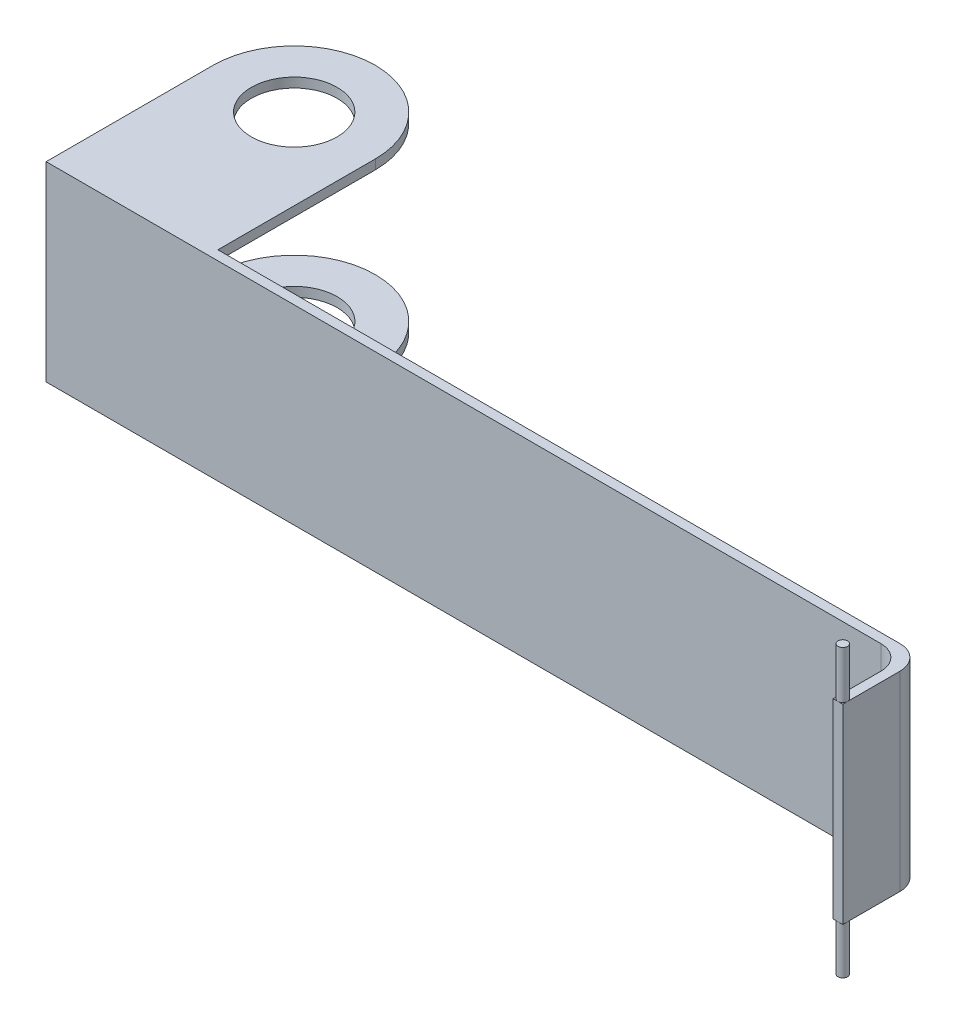
ISO-10303-21;
HEADER;
FILE_DESCRIPTION(('STEP AP214'),'2;1');
FILE_NAME('part.step','',(''),(''),'','','');
FILE_SCHEMA(('AUTOMOTIVE_DESIGN { 1 0 10303 214 1 1 1 1 }'));
ENDSEC;
DATA;
#1=APPLICATION_CONTEXT('core data for automotive mechanical design processes');
#2=APPLICATION_PROTOCOL_DEFINITION('international standard','automotive_design',2000,#1);
#3=PRODUCT_CONTEXT('',#1,'mechanical');
#4=PRODUCT('Part','Part','',(#3));
#5=PRODUCT_RELATED_PRODUCT_CATEGORY('part','',(#4));
#6=PRODUCT_DEFINITION_FORMATION('','',#4);
#7=PRODUCT_DEFINITION_CONTEXT('part definition',#1,'design');
#8=PRODUCT_DEFINITION('design','',#6,#7);
#9=PRODUCT_DEFINITION_SHAPE('','',#8);
#10=(LENGTH_UNIT() NAMED_UNIT(*) SI_UNIT(.MILLI.,.METRE.));
#11=(NAMED_UNIT(*) PLANE_ANGLE_UNIT() SI_UNIT($,.RADIAN.));
#12=(NAMED_UNIT(*) SI_UNIT($,.STERADIAN.) SOLID_ANGLE_UNIT());
#13=UNCERTAINTY_MEASURE_WITH_UNIT(LENGTH_MEASURE(1.E-05),#10,'distance_accuracy_value','');
#14=(GEOMETRIC_REPRESENTATION_CONTEXT(3) GLOBAL_UNCERTAINTY_ASSIGNED_CONTEXT((#13)) GLOBAL_UNIT_ASSIGNED_CONTEXT((#10,
#11,#12)) REPRESENTATION_CONTEXT('',''));
#15=CARTESIAN_POINT('',(0.,0.,0.));
#16=DIRECTION('',(0.,0.,1.));
#17=DIRECTION('',(1.,0.,0.));
#18=AXIS2_PLACEMENT_3D('',#15,#16,#17);
#19=CARTESIAN_POINT('',(0.,0.,0.));
#20=DIRECTION('',(0.,1.,0.));
#21=DIRECTION('',(0.,0.,1.));
#22=AXIS2_PLACEMENT_3D('',#19,#20,#21);
#23=PLANE('',#22);
#24=CARTESIAN_POINT('',(18.1,0.,1.4));
#25=DIRECTION('',(0.,-1.,0.));
#26=DIRECTION('',(0.,0.,-1.));
#27=AXIS2_PLACEMENT_3D('',#24,#25,#26);
#28=CIRCLE('',#27,0.0999999999999978);
#29=CARTESIAN_POINT('',(18.2,0.,1.4));
#30=VERTEX_POINT('',#29);
#31=CARTESIAN_POINT('',(18.1,0.,1.5));
#32=VERTEX_POINT('',#31);
#33=EDGE_CURVE('E66',#30,#32,#28,.T.);
#34=ORIENTED_EDGE('',*,*,#33,.F.);
#35=DIRECTION('',(0.,0.,1.));
#36=VECTOR('',#35,1.);
#37=CARTESIAN_POINT('',(18.2,0.,0.));
#38=LINE('',#37,#36);
#39=CARTESIAN_POINT('',(18.2,0.,1.5));
#40=VERTEX_POINT('',#39);
#41=EDGE_CURVE('E182',#30,#40,#38,.T.);
#42=ORIENTED_EDGE('',*,*,#41,.T.);
#43=DIRECTION('',(-1.,0.,0.));
#44=VECTOR('',#43,1.);
#45=CARTESIAN_POINT('',(0.,0.,1.5));
#46=LINE('',#45,#44);
#47=EDGE_CURVE('E193',#40,#32,#46,.T.);
#48=ORIENTED_EDGE('',*,*,#47,.T.);
#49=EDGE_LOOP('',(#34,#42,#48));
#50=FACE_BOUND('',#49,.T.);
#51=ADVANCED_FACE('F55',(#50),#23,.F.);
#52=CARTESIAN_POINT('',(18.,0.,1.4));
#53=VERTEX_POINT('',#52);
#54=EDGE_CURVE('E12',#32,#53,#28,.T.);
#55=ORIENTED_EDGE('',*,*,#54,.F.);
#56=CARTESIAN_POINT('',(18.,0.,1.5));
#57=VERTEX_POINT('',#56);
#58=EDGE_CURVE('E304',#32,#57,#46,.T.);
#59=ORIENTED_EDGE('',*,*,#58,.T.);
#60=DIRECTION('',(0.,0.,1.));
#61=VECTOR('',#60,1.);
#62=CARTESIAN_POINT('',(18.,0.,0.));
#63=LINE('',#62,#61);
#64=EDGE_CURVE('E300',#53,#57,#63,.T.);
#65=ORIENTED_EDGE('',*,*,#64,.F.);
#66=EDGE_LOOP('',(#55,#59,#65));
#67=FACE_BOUND('',#66,.T.);
#68=ADVANCED_FACE('F377',(#67),#23,.F.);
#69=CARTESIAN_POINT('',(0.,4.,0.));
#70=DIRECTION('',(0.,1.,0.));
#71=DIRECTION('',(0.,0.,1.));
#72=AXIS2_PLACEMENT_3D('',#69,#70,#71);
#73=PLANE('',#72);
#74=CARTESIAN_POINT('',(18.1,4.,1.4));
#75=DIRECTION('',(0.,1.,0.));
#76=DIRECTION('',(0.,0.,1.));
#77=AXIS2_PLACEMENT_3D('',#74,#75,#76);
#78=CIRCLE('',#77,0.0999999999999978);
#79=CARTESIAN_POINT('',(18.1,4.,1.5));
#80=VERTEX_POINT('',#79);
#81=CARTESIAN_POINT('',(18.2,4.,1.4));
#82=VERTEX_POINT('',#81);
#83=EDGE_CURVE('E201',#80,#82,#78,.T.);
#84=ORIENTED_EDGE('',*,*,#83,.F.);
#85=DIRECTION('',(-1.,0.,0.));
#86=VECTOR('',#85,1.);
#87=CARTESIAN_POINT('',(0.,4.,1.5));
#88=LINE('',#87,#86);
#89=CARTESIAN_POINT('',(18.2,4.,1.5));
#90=VERTEX_POINT('',#89);
#91=EDGE_CURVE('E288',#90,#80,#88,.T.);
#92=ORIENTED_EDGE('',*,*,#91,.F.);
#93=DIRECTION('',(0.,0.,1.));
#94=VECTOR('',#93,1.);
#95=CARTESIAN_POINT('',(18.2,4.,0.));
#96=LINE('',#95,#94);
#97=EDGE_CURVE('E271',#82,#90,#96,.T.);
#98=ORIENTED_EDGE('',*,*,#97,.F.);
#99=EDGE_LOOP('',(#84,#92,#98));
#100=FACE_BOUND('',#99,.T.);
#101=ADVANCED_FACE('F382',(#100),#73,.T.);
#102=CARTESIAN_POINT('',(18.,4.,1.4));
#103=VERTEX_POINT('',#102);
#104=EDGE_CURVE('E197',#82,#103,#78,.T.);
#105=ORIENTED_EDGE('',*,*,#104,.F.);
#106=CARTESIAN_POINT('',(18.2,4.,0.300000000000004));
#107=VERTEX_POINT('',#106);
#108=EDGE_CURVE('E267',#107,#82,#96,.T.);
#109=ORIENTED_EDGE('',*,*,#108,.F.);
#110=CARTESIAN_POINT('',(17.7,4.,0.3));
#111=DIRECTION('',(0.,1.,0.));
#112=DIRECTION('',(0.,0.,1.));
#113=AXIS2_PLACEMENT_3D('',#110,#111,#112);
#114=CIRCLE('',#113,0.5);
#115=CARTESIAN_POINT('',(17.7,4.,-0.2));
#116=VERTEX_POINT('',#115);
#117=EDGE_CURVE('E270',#107,#116,#114,.T.);
#118=ORIENTED_EDGE('',*,*,#117,.T.);
#119=DIRECTION('',(1.,0.,0.));
#120=VECTOR('',#119,1.);
#121=CARTESIAN_POINT('',(0.,4.,-0.2));
#122=LINE('',#121,#120);
#123=CARTESIAN_POINT('',(3.4,4.,-0.2));
#124=VERTEX_POINT('',#123);
#125=EDGE_CURVE('E274',#124,#116,#122,.T.);
#126=ORIENTED_EDGE('',*,*,#125,.F.);
#127=DIRECTION('',(0.,0.,-1.));
#128=VECTOR('',#127,1.);
#129=CARTESIAN_POINT('',(3.4,4.,-0.2));
#130=LINE('',#129,#128);
#131=CARTESIAN_POINT('',(3.4,4.,-3.5));
#132=VERTEX_POINT('',#131);
#133=EDGE_CURVE('E242',#124,#132,#130,.T.);
#134=ORIENTED_EDGE('',*,*,#133,.T.);
#135=CARTESIAN_POINT('',(1.7,4.,-3.5));
#136=DIRECTION('',(0.,1.,0.));
#137=DIRECTION('',(0.,0.,1.));
#138=AXIS2_PLACEMENT_3D('',#135,#136,#137);
#139=CIRCLE('',#138,1.7);
#140=CARTESIAN_POINT('',(0.,4.,-3.5));
#141=VERTEX_POINT('',#140);
#142=EDGE_CURVE('E249',#132,#141,#139,.T.);
#143=ORIENTED_EDGE('',*,*,#142,.T.);
#144=DIRECTION('',(0.,0.,-1.));
#145=VECTOR('',#144,1.);
#146=CARTESIAN_POINT('',(0.,4.,0.));
#147=LINE('',#146,#145);
#148=CARTESIAN_POINT('',(0.,4.,0.));
#149=VERTEX_POINT('',#148);
#150=EDGE_CURVE('E276',#149,#141,#147,.T.);
#151=ORIENTED_EDGE('',*,*,#150,.F.);
#152=DIRECTION('',(1.,0.,0.));
#153=VECTOR('',#152,1.);
#154=CARTESIAN_POINT('',(0.,4.,0.));
#155=LINE('',#154,#153);
#156=CARTESIAN_POINT('',(17.5,4.,0.));
#157=VERTEX_POINT('',#156);
#158=EDGE_CURVE('E278',#149,#157,#155,.T.);
#159=ORIENTED_EDGE('',*,*,#158,.T.);
#160=CARTESIAN_POINT('',(17.5,4.,0.5));
#161=DIRECTION('',(0.,1.,0.));
#162=DIRECTION('',(0.,0.,1.));
#163=AXIS2_PLACEMENT_3D('',#160,#161,#162);
#164=CIRCLE('',#163,0.5);
#165=CARTESIAN_POINT('',(18.,4.,0.500000000000004));
#166=VERTEX_POINT('',#165);
#167=EDGE_CURVE('E280',#166,#157,#164,.T.);
#168=ORIENTED_EDGE('',*,*,#167,.F.);
#169=DIRECTION('',(0.,0.,1.));
#170=VECTOR('',#169,1.);
#171=CARTESIAN_POINT('',(18.,4.,0.));
#172=LINE('',#171,#170);
#173=EDGE_CURVE('E284',#166,#103,#172,.T.);
#174=ORIENTED_EDGE('',*,*,#173,.T.);
#175=EDGE_LOOP('',(#105,#109,#118,#126,#134,#143,#151,#159,#168,#174));
#176=FACE_BOUND('',#175,.T.);
#177=CARTESIAN_POINT('',(1.7,4.,-3.5));
#178=DIRECTION('',(0.,1.,0.));
#179=DIRECTION('',(0.,0.,1.));
#180=AXIS2_PLACEMENT_3D('',#177,#178,#179);
#181=CIRCLE('',#180,0.9);
#182=CARTESIAN_POINT('',(1.7,4.,-2.6));
#183=VERTEX_POINT('',#182);
#184=EDGE_CURVE('E238',#183,#183,#181,.T.);
#185=ORIENTED_EDGE('',*,*,#184,.F.);
#186=EDGE_LOOP('',(#185));
#187=FACE_BOUND('',#186,.T.);
#188=ADVANCED_FACE('F341',(#176,#187),#73,.T.);
#189=CARTESIAN_POINT('',(18.2,4.,0.));
#190=DIRECTION('',(1.,0.,0.));
#191=DIRECTION('',(0.,0.,-1.));
#192=AXIS2_PLACEMENT_3D('',#189,#190,#191);
#193=PLANE('',#192);
#194=CARTESIAN_POINT('',(18.2,0.,0.300000000000004));
#195=VERTEX_POINT('',#194);
#196=EDGE_CURVE('E175',#195,#30,#38,.T.);
#197=ORIENTED_EDGE('',*,*,#196,.F.);
#198=DIRECTION('',(0.,-1.,0.));
#199=VECTOR('',#198,1.);
#200=CARTESIAN_POINT('',(18.2,4.,0.300000000000004));
#201=LINE('',#200,#199);
#202=EDGE_CURVE('E59',#107,#195,#201,.T.);
#203=ORIENTED_EDGE('',*,*,#202,.F.);
#204=ORIENTED_EDGE('',*,*,#108,.T.);
#205=ORIENTED_EDGE('',*,*,#97,.T.);
#206=DIRECTION('',(0.,-1.,0.));
#207=VECTOR('',#206,1.);
#208=CARTESIAN_POINT('',(18.2,4.,1.5));
#209=LINE('',#208,#207);
#210=EDGE_CURVE('E187',#90,#40,#209,.T.);
#211=ORIENTED_EDGE('',*,*,#210,.T.);
#212=ORIENTED_EDGE('',*,*,#41,.F.);
#213=EDGE_LOOP('',(#197,#203,#204,#205,#211,#212));
#214=FACE_BOUND('',#213,.T.);
#215=ADVANCED_FACE('F57',(#214),#193,.T.);
#216=CARTESIAN_POINT('',(17.7,4.,0.3));
#217=DIRECTION('',(0.,-1.,0.));
#218=DIRECTION('',(0.,0.,-1.));
#219=AXIS2_PLACEMENT_3D('',#216,#217,#218);
#220=CYLINDRICAL_SURFACE('',#219,0.5);
#221=CARTESIAN_POINT('',(17.7,0.,0.3));
#222=DIRECTION('',(0.,1.,0.));
#223=DIRECTION('',(0.,0.,1.));
#224=AXIS2_PLACEMENT_3D('',#221,#222,#223);
#225=CIRCLE('',#224,0.5);
#226=CARTESIAN_POINT('',(17.7,0.,-0.2));
#227=VERTEX_POINT('',#226);
#228=EDGE_CURVE('E180',#195,#227,#225,.T.);
#229=ORIENTED_EDGE('',*,*,#228,.T.);
#230=DIRECTION('',(0.,-1.,0.));
#231=VECTOR('',#230,1.);
#232=CARTESIAN_POINT('',(17.7,4.,-0.2));
#233=LINE('',#232,#231);
#234=EDGE_CURVE('E319',#116,#227,#233,.T.);
#235=ORIENTED_EDGE('',*,*,#234,.F.);
#236=ORIENTED_EDGE('',*,*,#117,.F.);
#237=ORIENTED_EDGE('',*,*,#202,.T.);
#238=EDGE_LOOP('',(#229,#235,#236,#237));
#239=FACE_BOUND('',#238,.T.);
#240=ADVANCED_FACE('F368',(#239),#220,.T.);
#241=CARTESIAN_POINT('',(0.,4.,-0.2));
#242=DIRECTION('',(0.,0.,-1.));
#243=DIRECTION('',(-1.,0.,0.));
#244=AXIS2_PLACEMENT_3D('',#241,#242,#243);
#245=PLANE('',#244);
#246=DIRECTION('',(0.,-1.,0.));
#247=VECTOR('',#246,1.);
#248=CARTESIAN_POINT('',(3.4,4.,-0.2));
#249=LINE('',#248,#247);
#250=CARTESIAN_POINT('',(3.4,0.2,-0.2));
#251=VERTEX_POINT('',#250);
#252=CARTESIAN_POINT('',(3.4,0.,-0.2));
#253=VERTEX_POINT('',#252);
#254=EDGE_CURVE('E230',#251,#253,#249,.T.);
#255=ORIENTED_EDGE('',*,*,#254,.F.);
#256=DIRECTION('',(-1.,0.,0.));
#257=VECTOR('',#256,1.);
#258=CARTESIAN_POINT('',(0.,0.2,-0.2));
#259=LINE('',#258,#257);
#260=CARTESIAN_POINT('',(0.,0.2,-0.2));
#261=VERTEX_POINT('',#260);
#262=EDGE_CURVE('E235',#251,#261,#259,.T.);
#263=ORIENTED_EDGE('',*,*,#262,.T.);
#264=DIRECTION('',(0.,-1.,0.));
#265=VECTOR('',#264,1.);
#266=CARTESIAN_POINT('',(0.,4.,-0.2));
#267=LINE('',#266,#265);
#268=CARTESIAN_POINT('',(0.,3.8,-0.2));
#269=VERTEX_POINT('',#268);
#270=EDGE_CURVE('E317',#269,#261,#267,.T.);
#271=ORIENTED_EDGE('',*,*,#270,.F.);
#272=DIRECTION('',(1.,0.,0.));
#273=VECTOR('',#272,1.);
#274=CARTESIAN_POINT('',(0.,3.8,-0.2));
#275=LINE('',#274,#273);
#276=CARTESIAN_POINT('',(3.4,3.8,-0.2));
#277=VERTEX_POINT('',#276);
#278=EDGE_CURVE('E254',#269,#277,#275,.T.);
#279=ORIENTED_EDGE('',*,*,#278,.T.);
#280=DIRECTION('',(0.,1.,0.));
#281=VECTOR('',#280,1.);
#282=CARTESIAN_POINT('',(3.4,3.8,-0.2));
#283=LINE('',#282,#281);
#284=EDGE_CURVE('E191',#277,#124,#283,.T.);
#285=ORIENTED_EDGE('',*,*,#284,.T.);
#286=ORIENTED_EDGE('',*,*,#125,.T.);
#287=ORIENTED_EDGE('',*,*,#234,.T.);
#288=DIRECTION('',(1.,0.,0.));
#289=VECTOR('',#288,1.);
#290=CARTESIAN_POINT('',(0.,0.,-0.2));
#291=LINE('',#290,#289);
#292=EDGE_CURVE('E291',#253,#227,#291,.T.);
#293=ORIENTED_EDGE('',*,*,#292,.F.);
#294=EDGE_LOOP('',(#255,#263,#271,#279,#285,#286,#287,#293));
#295=FACE_BOUND('',#294,.T.);
#296=ADVANCED_FACE('F366',(#295),#245,.T.);
#297=CARTESIAN_POINT('',(0.,4.,0.));
#298=DIRECTION('',(-1.,0.,0.));
#299=DIRECTION('',(0.,0.,1.));
#300=AXIS2_PLACEMENT_3D('',#297,#298,#299);
#301=PLANE('',#300);
#302=DIRECTION('',(0.,0.,-1.));
#303=VECTOR('',#302,1.);
#304=CARTESIAN_POINT('',(0.,0.,0.));
#305=LINE('',#304,#303);
#306=CARTESIAN_POINT('',(0.,0.,0.));
#307=VERTEX_POINT('',#306);
#308=CARTESIAN_POINT('',(0.,0.,-3.5));
#309=VERTEX_POINT('',#308);
#310=EDGE_CURVE('E293',#307,#309,#305,.T.);
#311=ORIENTED_EDGE('',*,*,#310,.F.);
#312=DIRECTION('',(0.,-1.,0.));
#313=VECTOR('',#312,1.);
#314=CARTESIAN_POINT('',(0.,4.,0.));
#315=LINE('',#314,#313);
#316=EDGE_CURVE('E315',#149,#307,#315,.T.);
#317=ORIENTED_EDGE('',*,*,#316,.F.);
#318=ORIENTED_EDGE('',*,*,#150,.T.);
#319=DIRECTION('',(0.,1.,0.));
#320=VECTOR('',#319,1.);
#321=CARTESIAN_POINT('',(0.,3.8,-3.5));
#322=LINE('',#321,#320);
#323=CARTESIAN_POINT('',(0.,3.8,-3.5));
#324=VERTEX_POINT('',#323);
#325=EDGE_CURVE('E263',#324,#141,#322,.T.);
#326=ORIENTED_EDGE('',*,*,#325,.F.);
#327=DIRECTION('',(0.,0.,-1.));
#328=VECTOR('',#327,1.);
#329=CARTESIAN_POINT('',(0.,3.8,-0.2));
#330=LINE('',#329,#328);
#331=EDGE_CURVE('E252',#269,#324,#330,.T.);
#332=ORIENTED_EDGE('',*,*,#331,.F.);
#333=ORIENTED_EDGE('',*,*,#270,.T.);
#334=DIRECTION('',(0.,0.,-1.));
#335=VECTOR('',#334,1.);
#336=CARTESIAN_POINT('',(0.,0.2,0.));
#337=LINE('',#336,#335);
#338=CARTESIAN_POINT('',(0.,0.2,-3.5));
#339=VERTEX_POINT('',#338);
#340=EDGE_CURVE('E215',#261,#339,#337,.T.);
#341=ORIENTED_EDGE('',*,*,#340,.T.);
#342=DIRECTION('',(0.,-1.,0.));
#343=VECTOR('',#342,1.);
#344=CARTESIAN_POINT('',(0.,0.2,-3.5));
#345=LINE('',#344,#343);
#346=EDGE_CURVE('E224',#339,#309,#345,.T.);
#347=ORIENTED_EDGE('',*,*,#346,.T.);
#348=EDGE_LOOP('',(#311,#317,#318,#326,#332,#333,#341,#347));
#349=FACE_BOUND('',#348,.T.);
#350=ADVANCED_FACE('F355',(#349),#301,.T.);
#351=CARTESIAN_POINT('',(0.,4.,0.));
#352=DIRECTION('',(0.,0.,-1.));
#353=DIRECTION('',(-1.,0.,0.));
#354=AXIS2_PLACEMENT_3D('',#351,#352,#353);
#355=PLANE('',#354);
#356=DIRECTION('',(1.,0.,0.));
#357=VECTOR('',#356,1.);
#358=CARTESIAN_POINT('',(0.,0.,0.));
#359=LINE('',#358,#357);
#360=CARTESIAN_POINT('',(17.5,0.,0.));
#361=VERTEX_POINT('',#360);
#362=EDGE_CURVE('E295',#307,#361,#359,.T.);
#363=ORIENTED_EDGE('',*,*,#362,.T.);
#364=DIRECTION('',(0.,-1.,0.));
#365=VECTOR('',#364,1.);
#366=CARTESIAN_POINT('',(17.5,4.,0.));
#367=LINE('',#366,#365);
#368=EDGE_CURVE('E312',#157,#361,#367,.T.);
#369=ORIENTED_EDGE('',*,*,#368,.F.);
#370=ORIENTED_EDGE('',*,*,#158,.F.);
#371=ORIENTED_EDGE('',*,*,#316,.T.);
#372=EDGE_LOOP('',(#363,#369,#370,#371));
#373=FACE_BOUND('',#372,.T.);
#374=ADVANCED_FACE('F374',(#373),#355,.F.);
#375=CARTESIAN_POINT('',(17.5,4.,0.5));
#376=DIRECTION('',(0.,-1.,0.));
#377=DIRECTION('',(0.,0.,-1.));
#378=AXIS2_PLACEMENT_3D('',#375,#376,#377);
#379=CYLINDRICAL_SURFACE('',#378,0.5);
#380=CARTESIAN_POINT('',(17.5,0.,0.5));
#381=DIRECTION('',(0.,1.,0.));
#382=DIRECTION('',(0.,0.,1.));
#383=AXIS2_PLACEMENT_3D('',#380,#381,#382);
#384=CIRCLE('',#383,0.5);
#385=CARTESIAN_POINT('',(18.,0.,0.500000000000004));
#386=VERTEX_POINT('',#385);
#387=EDGE_CURVE('E297',#386,#361,#384,.T.);
#388=ORIENTED_EDGE('',*,*,#387,.F.);
#389=DIRECTION('',(0.,-1.,0.));
#390=VECTOR('',#389,1.);
#391=CARTESIAN_POINT('',(18.,4.,0.500000000000004));
#392=LINE('',#391,#390);
#393=EDGE_CURVE('E310',#166,#386,#392,.T.);
#394=ORIENTED_EDGE('',*,*,#393,.F.);
#395=ORIENTED_EDGE('',*,*,#167,.T.);
#396=ORIENTED_EDGE('',*,*,#368,.T.);
#397=EDGE_LOOP('',(#388,#394,#395,#396));
#398=FACE_BOUND('',#397,.T.);
#399=ADVANCED_FACE('F350',(#398),#379,.F.);
#400=CARTESIAN_POINT('',(18.,4.,0.));
#401=DIRECTION('',(1.,0.,0.));
#402=DIRECTION('',(0.,0.,-1.));
#403=AXIS2_PLACEMENT_3D('',#400,#401,#402);
#404=PLANE('',#403);
#405=EDGE_CURVE('E301',#386,#53,#63,.T.);
#406=ORIENTED_EDGE('',*,*,#405,.T.);
#407=ORIENTED_EDGE('',*,*,#64,.T.);
#408=DIRECTION('',(0.,-1.,0.));
#409=VECTOR('',#408,1.);
#410=CARTESIAN_POINT('',(18.,4.,1.5));
#411=LINE('',#410,#409);
#412=CARTESIAN_POINT('',(18.,4.,1.5));
#413=VERTEX_POINT('',#412);
#414=EDGE_CURVE('E307',#413,#57,#411,.T.);
#415=ORIENTED_EDGE('',*,*,#414,.F.);
#416=EDGE_CURVE('E283',#103,#413,#172,.T.);
#417=ORIENTED_EDGE('',*,*,#416,.F.);
#418=ORIENTED_EDGE('',*,*,#173,.F.);
#419=ORIENTED_EDGE('',*,*,#393,.T.);
#420=EDGE_LOOP('',(#406,#407,#415,#417,#418,#419));
#421=FACE_BOUND('',#420,.T.);
#422=ADVANCED_FACE('F338',(#421),#404,.F.);
#423=CARTESIAN_POINT('',(0.,4.,1.5));
#424=DIRECTION('',(0.,0.,1.));
#425=DIRECTION('',(1.,0.,0.));
#426=AXIS2_PLACEMENT_3D('',#423,#424,#425);
#427=PLANE('',#426);
#428=ORIENTED_EDGE('',*,*,#47,.F.);
#429=ORIENTED_EDGE('',*,*,#210,.F.);
#430=ORIENTED_EDGE('',*,*,#91,.T.);
#431=EDGE_CURVE('E287',#80,#413,#88,.T.);
#432=ORIENTED_EDGE('',*,*,#431,.T.);
#433=ORIENTED_EDGE('',*,*,#414,.T.);
#434=ORIENTED_EDGE('',*,*,#58,.F.);
#435=EDGE_LOOP('',(#428,#429,#430,#432,#433,#434));
#436=FACE_BOUND('',#435,.T.);
#437=ADVANCED_FACE('F394',(#436),#427,.T.);
#438=EDGE_CURVE('E199',#103,#80,#78,.T.);
#439=ORIENTED_EDGE('',*,*,#438,.F.);
#440=ORIENTED_EDGE('',*,*,#416,.T.);
#441=ORIENTED_EDGE('',*,*,#431,.F.);
#442=EDGE_LOOP('',(#439,#440,#441));
#443=FACE_BOUND('',#442,.T.);
#444=ADVANCED_FACE('F334',(#443),#73,.T.);
#445=EDGE_CURVE('E64',#53,#30,#28,.T.);
#446=ORIENTED_EDGE('',*,*,#445,.F.);
#447=ORIENTED_EDGE('',*,*,#405,.F.);
#448=ORIENTED_EDGE('',*,*,#387,.T.);
#449=ORIENTED_EDGE('',*,*,#362,.F.);
#450=ORIENTED_EDGE('',*,*,#310,.T.);
#451=CARTESIAN_POINT('',(1.7,0.,-3.5));
#452=DIRECTION('',(0.,-1.,0.));
#453=DIRECTION('',(0.,0.,-1.));
#454=AXIS2_PLACEMENT_3D('',#451,#452,#453);
#455=CIRCLE('',#454,1.7);
#456=CARTESIAN_POINT('',(3.4,0.,-3.5));
#457=VERTEX_POINT('',#456);
#458=EDGE_CURVE('E212',#309,#457,#455,.T.);
#459=ORIENTED_EDGE('',*,*,#458,.T.);
#460=DIRECTION('',(0.,0.,1.));
#461=VECTOR('',#460,1.);
#462=CARTESIAN_POINT('',(3.4,0.,0.));
#463=LINE('',#462,#461);
#464=EDGE_CURVE('E218',#457,#253,#463,.T.);
#465=ORIENTED_EDGE('',*,*,#464,.T.);
#466=ORIENTED_EDGE('',*,*,#292,.T.);
#467=ORIENTED_EDGE('',*,*,#228,.F.);
#468=ORIENTED_EDGE('',*,*,#196,.T.);
#469=EDGE_LOOP('',(#446,#447,#448,#449,#450,#459,#465,#466,#467,#468));
#470=FACE_BOUND('',#469,.T.);
#471=CARTESIAN_POINT('',(1.7,0.,-3.5));
#472=DIRECTION('',(0.,-1.,0.));
#473=DIRECTION('',(0.,0.,-1.));
#474=AXIS2_PLACEMENT_3D('',#471,#472,#473);
#475=CIRCLE('',#474,0.9);
#476=CARTESIAN_POINT('',(1.7,0.,-4.4));
#477=VERTEX_POINT('',#476);
#478=EDGE_CURVE('E206',#477,#477,#475,.T.);
#479=ORIENTED_EDGE('',*,*,#478,.F.);
#480=EDGE_LOOP('',(#479));
#481=FACE_BOUND('',#480,.T.);
#482=ADVANCED_FACE('F177',(#470,#481),#23,.F.);
#483=CARTESIAN_POINT('',(3.4,3.8,-0.2));
#484=DIRECTION('',(1.,0.,0.));
#485=DIRECTION('',(0.,0.,-1.));
#486=AXIS2_PLACEMENT_3D('',#483,#484,#485);
#487=PLANE('',#486);
#488=ORIENTED_EDGE('',*,*,#133,.F.);
#489=ORIENTED_EDGE('',*,*,#284,.F.);
#490=DIRECTION('',(0.,0.,-1.));
#491=VECTOR('',#490,1.);
#492=CARTESIAN_POINT('',(3.4,3.8,-0.2));
#493=LINE('',#492,#491);
#494=CARTESIAN_POINT('',(3.4,3.8,-3.5));
#495=VERTEX_POINT('',#494);
#496=EDGE_CURVE('E245',#277,#495,#493,.T.);
#497=ORIENTED_EDGE('',*,*,#496,.T.);
#498=DIRECTION('',(0.,1.,0.));
#499=VECTOR('',#498,1.);
#500=CARTESIAN_POINT('',(3.4,3.8,-3.5));
#501=LINE('',#500,#499);
#502=EDGE_CURVE('E256',#495,#132,#501,.T.);
#503=ORIENTED_EDGE('',*,*,#502,.T.);
#504=EDGE_LOOP('',(#488,#489,#497,#503));
#505=FACE_BOUND('',#504,.T.);
#506=ADVANCED_FACE('F386',(#505),#487,.T.);
#507=CARTESIAN_POINT('',(1.7,3.8,-3.5));
#508=DIRECTION('',(0.,1.,0.));
#509=DIRECTION('',(0.,0.,1.));
#510=AXIS2_PLACEMENT_3D('',#507,#508,#509);
#511=CYLINDRICAL_SURFACE('',#510,1.7);
#512=ORIENTED_EDGE('',*,*,#142,.F.);
#513=ORIENTED_EDGE('',*,*,#502,.F.);
#514=CARTESIAN_POINT('',(1.7,3.8,-3.5));
#515=DIRECTION('',(0.,1.,0.));
#516=DIRECTION('',(0.,0.,1.));
#517=AXIS2_PLACEMENT_3D('',#514,#515,#516);
#518=CIRCLE('',#517,1.7);
#519=EDGE_CURVE('E248',#495,#324,#518,.T.);
#520=ORIENTED_EDGE('',*,*,#519,.T.);
#521=ORIENTED_EDGE('',*,*,#325,.T.);
#522=EDGE_LOOP('',(#512,#513,#520,#521));
#523=FACE_BOUND('',#522,.T.);
#524=ADVANCED_FACE('F391',(#523),#511,.T.);
#525=CARTESIAN_POINT('',(1.7,3.8,-3.5));
#526=DIRECTION('',(0.,1.,0.));
#527=DIRECTION('',(0.,0.,1.));
#528=AXIS2_PLACEMENT_3D('',#525,#526,#527);
#529=PLANE('',#528);
#530=CARTESIAN_POINT('',(1.7,3.8,-3.5));
#531=DIRECTION('',(0.,1.,0.));
#532=DIRECTION('',(0.,0.,1.));
#533=AXIS2_PLACEMENT_3D('',#530,#531,#532);
#534=CIRCLE('',#533,0.9);
#535=CARTESIAN_POINT('',(1.7,3.8,-2.6));
#536=VERTEX_POINT('',#535);
#537=EDGE_CURVE('E239',#536,#536,#534,.T.);
#538=ORIENTED_EDGE('',*,*,#537,.T.);
#539=EDGE_LOOP('',(#538));
#540=FACE_BOUND('',#539,.T.);
#541=ORIENTED_EDGE('',*,*,#496,.F.);
#542=ORIENTED_EDGE('',*,*,#278,.F.);
#543=ORIENTED_EDGE('',*,*,#331,.T.);
#544=ORIENTED_EDGE('',*,*,#519,.F.);
#545=EDGE_LOOP('',(#541,#542,#543,#544));
#546=FACE_BOUND('',#545,.T.);
#547=ADVANCED_FACE('F442',(#540,#546),#529,.F.);
#548=CARTESIAN_POINT('',(1.7,3.8,-3.5));
#549=DIRECTION('',(0.,1.,0.));
#550=DIRECTION('',(0.,0.,1.));
#551=AXIS2_PLACEMENT_3D('',#548,#549,#550);
#552=CYLINDRICAL_SURFACE('',#551,0.9);
#553=ORIENTED_EDGE('',*,*,#537,.F.);
#554=EDGE_LOOP('',(#553));
#555=FACE_BOUND('',#554,.T.);
#556=ORIENTED_EDGE('',*,*,#184,.T.);
#557=EDGE_LOOP('',(#556));
#558=FACE_BOUND('',#557,.T.);
#559=ADVANCED_FACE('F452',(#555,#558),#552,.F.);
#560=CARTESIAN_POINT('',(3.4,0.2,0.));
#561=DIRECTION('',(1.,0.,0.));
#562=DIRECTION('',(0.,0.,-1.));
#563=AXIS2_PLACEMENT_3D('',#560,#561,#562);
#564=PLANE('',#563);
#565=DIRECTION('',(0.,0.,1.));
#566=VECTOR('',#565,1.);
#567=CARTESIAN_POINT('',(3.4,0.2,0.));
#568=LINE('',#567,#566);
#569=CARTESIAN_POINT('',(3.4,0.2,-3.5));
#570=VERTEX_POINT('',#569);
#571=EDGE_CURVE('E221',#570,#251,#568,.T.);
#572=ORIENTED_EDGE('',*,*,#571,.T.);
#573=ORIENTED_EDGE('',*,*,#254,.T.);
#574=ORIENTED_EDGE('',*,*,#464,.F.);
#575=DIRECTION('',(0.,-1.,0.));
#576=VECTOR('',#575,1.);
#577=CARTESIAN_POINT('',(3.4,0.2,-3.5));
#578=LINE('',#577,#576);
#579=EDGE_CURVE('E228',#570,#457,#578,.T.);
#580=ORIENTED_EDGE('',*,*,#579,.F.);
#581=EDGE_LOOP('',(#572,#573,#574,#580));
#582=FACE_BOUND('',#581,.T.);
#583=ADVANCED_FACE('F364',(#582),#564,.T.);
#584=CARTESIAN_POINT('',(1.7,0.2,-3.5));
#585=DIRECTION('',(0.,-1.,0.));
#586=DIRECTION('',(0.,0.,-1.));
#587=AXIS2_PLACEMENT_3D('',#584,#585,#586);
#588=CYLINDRICAL_SURFACE('',#587,1.7);
#589=ORIENTED_EDGE('',*,*,#458,.F.);
#590=ORIENTED_EDGE('',*,*,#346,.F.);
#591=CARTESIAN_POINT('',(1.7,0.2,-3.5));
#592=DIRECTION('',(0.,-1.,0.));
#593=DIRECTION('',(0.,0.,-1.));
#594=AXIS2_PLACEMENT_3D('',#591,#592,#593);
#595=CIRCLE('',#594,1.7);
#596=EDGE_CURVE('E217',#339,#570,#595,.T.);
#597=ORIENTED_EDGE('',*,*,#596,.T.);
#598=ORIENTED_EDGE('',*,*,#579,.T.);
#599=EDGE_LOOP('',(#589,#590,#597,#598));
#600=FACE_BOUND('',#599,.T.);
#601=ADVANCED_FACE('F360',(#600),#588,.T.);
#602=CARTESIAN_POINT('',(1.7,0.2,-3.5));
#603=DIRECTION('',(0.,-1.,0.));
#604=DIRECTION('',(0.,0.,-1.));
#605=AXIS2_PLACEMENT_3D('',#602,#603,#604);
#606=PLANE('',#605);
#607=ORIENTED_EDGE('',*,*,#262,.F.);
#608=ORIENTED_EDGE('',*,*,#571,.F.);
#609=ORIENTED_EDGE('',*,*,#596,.F.);
#610=ORIENTED_EDGE('',*,*,#340,.F.);
#611=EDGE_LOOP('',(#607,#608,#609,#610));
#612=FACE_BOUND('',#611,.T.);
#613=CARTESIAN_POINT('',(1.7,0.2,-3.5));
#614=DIRECTION('',(0.,-1.,0.));
#615=DIRECTION('',(0.,0.,-1.));
#616=AXIS2_PLACEMENT_3D('',#613,#614,#615);
#617=CIRCLE('',#616,0.9);
#618=CARTESIAN_POINT('',(1.7,0.2,-4.4));
#619=VERTEX_POINT('',#618);
#620=EDGE_CURVE('E209',#619,#619,#617,.T.);
#621=ORIENTED_EDGE('',*,*,#620,.T.);
#622=EDGE_LOOP('',(#621));
#623=FACE_BOUND('',#622,.T.);
#624=ADVANCED_FACE('F497',(#612,#623),#606,.F.);
#625=CARTESIAN_POINT('',(1.7,0.2,-3.5));
#626=DIRECTION('',(0.,-1.,0.));
#627=DIRECTION('',(0.,0.,-1.));
#628=AXIS2_PLACEMENT_3D('',#625,#626,#627);
#629=CYLINDRICAL_SURFACE('',#628,0.9);
#630=ORIENTED_EDGE('',*,*,#620,.F.);
#631=EDGE_LOOP('',(#630));
#632=FACE_BOUND('',#631,.T.);
#633=ORIENTED_EDGE('',*,*,#478,.T.);
#634=EDGE_LOOP('',(#633));
#635=FACE_BOUND('',#634,.T.);
#636=ADVANCED_FACE('F506',(#632,#635),#629,.F.);
#637=CARTESIAN_POINT('',(18.1,5.,1.4));
#638=DIRECTION('',(0.,-1.,0.));
#639=DIRECTION('',(0.,0.,-1.));
#640=AXIS2_PLACEMENT_3D('',#637,#638,#639);
#641=CYLINDRICAL_SURFACE('',#640,0.0999999999999978);
#642=CARTESIAN_POINT('',(18.1,5.,1.4));
#643=DIRECTION('',(0.,1.,0.));
#644=DIRECTION('',(0.,0.,1.));
#645=AXIS2_PLACEMENT_3D('',#642,#643,#644);
#646=CIRCLE('',#645,0.0999999999999978);
#647=CARTESIAN_POINT('',(18.1,5.,1.5));
#648=VERTEX_POINT('',#647);
#649=EDGE_CURVE('E204',#648,#648,#646,.T.);
#650=ORIENTED_EDGE('',*,*,#649,.F.);
#651=EDGE_LOOP('',(#650));
#652=FACE_BOUND('',#651,.T.);
#653=ORIENTED_EDGE('',*,*,#83,.T.);
#654=ORIENTED_EDGE('',*,*,#104,.T.);
#655=ORIENTED_EDGE('',*,*,#438,.T.);
#656=EDGE_LOOP('',(#653,#654,#655));
#657=FACE_BOUND('',#656,.T.);
#658=ADVANCED_FACE('F328',(#652,#657),#641,.T.);
#659=CARTESIAN_POINT('',(18.1,5.,1.4));
#660=DIRECTION('',(0.,1.,0.));
#661=DIRECTION('',(0.,0.,1.));
#662=AXIS2_PLACEMENT_3D('',#659,#660,#661);
#663=PLANE('',#662);
#664=ORIENTED_EDGE('',*,*,#649,.T.);
#665=EDGE_LOOP('',(#664));
#666=FACE_BOUND('',#665,.T.);
#667=ADVANCED_FACE('F541',(#666),#663,.T.);
#668=CARTESIAN_POINT('',(18.1,-1.,1.4));
#669=DIRECTION('',(0.,1.,0.));
#670=DIRECTION('',(0.,0.,1.));
#671=AXIS2_PLACEMENT_3D('',#668,#669,#670);
#672=CYLINDRICAL_SURFACE('',#671,0.0999999999999978);
#673=CARTESIAN_POINT('',(18.1,-1.,1.4));
#674=DIRECTION('',(0.,-1.,0.));
#675=DIRECTION('',(0.,0.,-1.));
#676=AXIS2_PLACEMENT_3D('',#673,#674,#675);
#677=CIRCLE('',#676,0.0999999999999978);
#678=CARTESIAN_POINT('',(18.1,-1.,1.3));
#679=VERTEX_POINT('',#678);
#680=EDGE_CURVE('E195',#679,#679,#677,.T.);
#681=ORIENTED_EDGE('',*,*,#680,.F.);
#682=EDGE_LOOP('',(#681));
#683=FACE_BOUND('',#682,.T.);
#684=ORIENTED_EDGE('',*,*,#33,.T.);
#685=ORIENTED_EDGE('',*,*,#54,.T.);
#686=ORIENTED_EDGE('',*,*,#445,.T.);
#687=EDGE_LOOP('',(#684,#685,#686));
#688=FACE_BOUND('',#687,.T.);
#689=ADVANCED_FACE('F196',(#683,#688),#672,.T.);
#690=CARTESIAN_POINT('',(18.1,-1.,1.4));
#691=DIRECTION('',(0.,-1.,0.));
#692=DIRECTION('',(0.,0.,-1.));
#693=AXIS2_PLACEMENT_3D('',#690,#691,#692);
#694=PLANE('',#693);
#695=ORIENTED_EDGE('',*,*,#680,.T.);
#696=EDGE_LOOP('',(#695));
#697=FACE_BOUND('',#696,.T.);
#698=ADVANCED_FACE('F576',(#697),#694,.T.);
#699=CLOSED_SHELL('',(#51,#68,#101,#188,#215,#240,#296,#350,#374,#399,#422,#437,#444,#482,#506,
#524,#547,#559,#583,#601,#624,#636,#658,#667,#689,#698));
#700=MANIFOLD_SOLID_BREP('B2',#699);
#701=ADVANCED_BREP_SHAPE_REPRESENTATION('',(#18,#700),#14);
#702=SHAPE_DEFINITION_REPRESENTATION(#9,#701);
ENDSEC;
END-ISO-10303-21;
